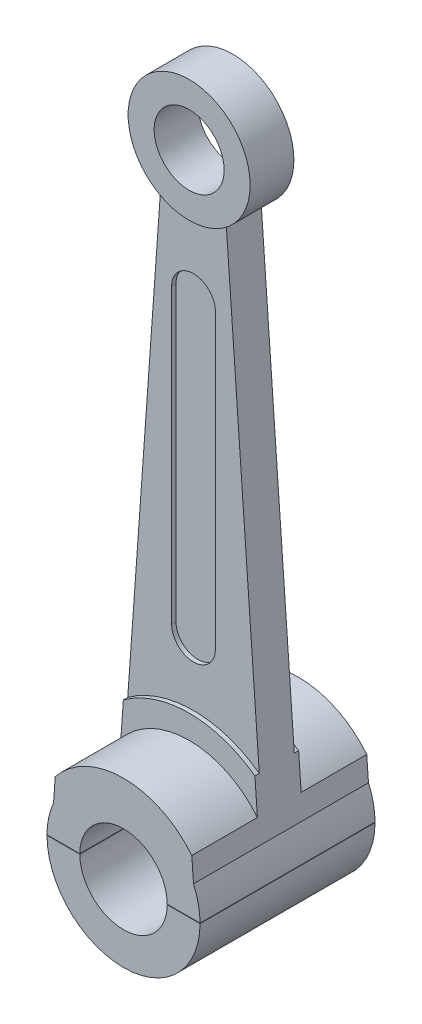
ISO-10303-21;
HEADER;
FILE_DESCRIPTION(('STEP AP214'),'2;1');
FILE_NAME('part.step','',(''),(''),'','','');
FILE_SCHEMA(('AUTOMOTIVE_DESIGN { 1 0 10303 214 1 1 1 1 }'));
ENDSEC;
DATA;
#1=APPLICATION_CONTEXT('core data for automotive mechanical design processes');
#2=APPLICATION_PROTOCOL_DEFINITION('international standard','automotive_design',2000,#1);
#3=PRODUCT_CONTEXT('',#1,'mechanical');
#4=PRODUCT('Part','Part','',(#3));
#5=PRODUCT_RELATED_PRODUCT_CATEGORY('part','',(#4));
#6=PRODUCT_DEFINITION_FORMATION('','',#4);
#7=PRODUCT_DEFINITION_CONTEXT('part definition',#1,'design');
#8=PRODUCT_DEFINITION('design','',#6,#7);
#9=PRODUCT_DEFINITION_SHAPE('','',#8);
#10=(LENGTH_UNIT() NAMED_UNIT(*) SI_UNIT(.MILLI.,.METRE.));
#11=(NAMED_UNIT(*) PLANE_ANGLE_UNIT() SI_UNIT($,.RADIAN.));
#12=(NAMED_UNIT(*) SI_UNIT($,.STERADIAN.) SOLID_ANGLE_UNIT());
#13=UNCERTAINTY_MEASURE_WITH_UNIT(LENGTH_MEASURE(1.E-05),#10,'distance_accuracy_value','');
#14=(GEOMETRIC_REPRESENTATION_CONTEXT(3) GLOBAL_UNCERTAINTY_ASSIGNED_CONTEXT((#13)) GLOBAL_UNIT_ASSIGNED_CONTEXT((#10,
#11,#12)) REPRESENTATION_CONTEXT('',''));
#15=CARTESIAN_POINT('',(0.,0.,0.));
#16=DIRECTION('',(0.,0.,1.));
#17=DIRECTION('',(1.,0.,0.));
#18=AXIS2_PLACEMENT_3D('',#15,#16,#17);
#19=CARTESIAN_POINT('',(0.,0.,-2.));
#20=DIRECTION('',(0.,0.,1.));
#21=DIRECTION('',(1.,0.,0.));
#22=AXIS2_PLACEMENT_3D('',#19,#20,#21);
#23=CYLINDRICAL_SURFACE('',#22,1.75);
#24=CARTESIAN_POINT('',(0.,0.,-2.));
#25=DIRECTION('',(0.,0.,-1.));
#26=DIRECTION('',(-1.,0.,0.));
#27=AXIS2_PLACEMENT_3D('',#24,#25,#26);
#28=CIRCLE('',#27,1.75);
#29=CARTESIAN_POINT('',(-1.74999285712828,0.00499999999999999,-2.));
#30=VERTEX_POINT('',#29);
#31=CARTESIAN_POINT('',(-1.6,0.708872343937891,-2.));
#32=VERTEX_POINT('',#31);
#33=EDGE_CURVE('E389',#30,#32,#28,.T.);
#34=ORIENTED_EDGE('',*,*,#33,.F.);
#35=DIRECTION('',(0.,0.,1.));
#36=VECTOR('',#35,1.);
#37=CARTESIAN_POINT('',(-1.74999285712828,0.00499999999999999,-2.));
#38=LINE('',#37,#36);
#39=CARTESIAN_POINT('',(-1.74999285712828,0.00499999999999999,2.));
#40=VERTEX_POINT('',#39);
#41=EDGE_CURVE('E237',#30,#40,#38,.T.);
#42=ORIENTED_EDGE('',*,*,#41,.T.);
#43=CARTESIAN_POINT('',(0.,0.,2.));
#44=DIRECTION('',(0.,0.,-1.));
#45=DIRECTION('',(-1.,0.,0.));
#46=AXIS2_PLACEMENT_3D('',#43,#44,#45);
#47=CIRCLE('',#46,1.75);
#48=CARTESIAN_POINT('',(-1.6,0.708872343937891,2.));
#49=VERTEX_POINT('',#48);
#50=EDGE_CURVE('E232',#40,#49,#47,.T.);
#51=ORIENTED_EDGE('',*,*,#50,.T.);
#52=DIRECTION('',(0.,0.,1.));
#53=VECTOR('',#52,1.);
#54=CARTESIAN_POINT('',(-1.6,0.708872343937891,-2.));
#55=LINE('',#54,#53);
#56=EDGE_CURVE('E374',#32,#49,#55,.T.);
#57=ORIENTED_EDGE('',*,*,#56,.F.);
#58=EDGE_LOOP('',(#34,#42,#51,#57));
#59=FACE_BOUND('',#58,.T.);
#60=ADVANCED_FACE('F43',(#59),#23,.T.);
#61=CARTESIAN_POINT('',(0.,0.,0.5));
#62=DIRECTION('',(0.,0.,-1.));
#63=DIRECTION('',(-1.,0.,0.));
#64=AXIS2_PLACEMENT_3D('',#61,#62,#63);
#65=CYLINDRICAL_SURFACE('',#64,2.54);
#66=CARTESIAN_POINT('',(0.,0.,0.5));
#67=DIRECTION('',(0.,0.,1.));
#68=DIRECTION('',(1.,0.,0.));
#69=AXIS2_PLACEMENT_3D('',#66,#67,#68);
#70=CIRCLE('',#69,2.54);
#71=CARTESIAN_POINT('',(1.5036414370813,2.04711075144753,0.5));
#72=VERTEX_POINT('',#71);
#73=CARTESIAN_POINT('',(-1.5036414370813,2.04711075144753,0.5));
#74=VERTEX_POINT('',#73);
#75=EDGE_CURVE('E328',#72,#74,#70,.T.);
#76=ORIENTED_EDGE('',*,*,#75,.F.);
#77=DIRECTION('',(0.,0.,-1.));
#78=VECTOR('',#77,1.);
#79=CARTESIAN_POINT('',(1.5036414370813,2.04711075144753,0.5));
#80=LINE('',#79,#78);
#81=CARTESIAN_POINT('',(1.5036414370813,2.04711075144753,0.4));
#82=VERTEX_POINT('',#81);
#83=EDGE_CURVE('E236',#72,#82,#80,.T.);
#84=ORIENTED_EDGE('',*,*,#83,.T.);
#85=CARTESIAN_POINT('',(0.,0.,0.4));
#86=DIRECTION('',(0.,0.,1.));
#87=DIRECTION('',(1.,0.,0.));
#88=AXIS2_PLACEMENT_3D('',#85,#86,#87);
#89=CIRCLE('',#88,2.54);
#90=CARTESIAN_POINT('',(-1.5036414370813,2.04711075144753,0.4));
#91=VERTEX_POINT('',#90);
#92=EDGE_CURVE('E244',#82,#91,#89,.T.);
#93=ORIENTED_EDGE('',*,*,#92,.T.);
#94=DIRECTION('',(0.,0.,-1.));
#95=VECTOR('',#94,1.);
#96=CARTESIAN_POINT('',(-1.5036414370813,2.04711075144753,0.5));
#97=LINE('',#96,#95);
#98=EDGE_CURVE('E314',#91,#74,#97,.F.);
#99=ORIENTED_EDGE('',*,*,#98,.T.);
#100=EDGE_LOOP('',(#76,#84,#93,#99));
#101=FACE_BOUND('',#100,.T.);
#102=ADVANCED_FACE('F434',(#101),#65,.T.);
#103=CARTESIAN_POINT('',(0.,4.,0.4));
#104=DIRECTION('',(0.,0.,-1.));
#105=DIRECTION('',(-1.,0.,0.));
#106=AXIS2_PLACEMENT_3D('',#103,#104,#105);
#107=CYLINDRICAL_SURFACE('',#106,0.5);
#108=DIRECTION('',(0.,0.,-1.));
#109=VECTOR('',#108,1.);
#110=CARTESIAN_POINT('',(-0.499999999999999,4.,0.4));
#111=LINE('',#110,#109);
#112=CARTESIAN_POINT('',(-0.499999999999999,4.,-0.3));
#113=VERTEX_POINT('',#112);
#114=CARTESIAN_POINT('',(-0.499999999999999,4.,-0.4));
#115=VERTEX_POINT('',#114);
#116=EDGE_CURVE('E276',#113,#115,#111,.T.);
#117=ORIENTED_EDGE('',*,*,#116,.F.);
#118=CARTESIAN_POINT('',(0.,4.,-0.3));
#119=DIRECTION('',(0.,0.,1.));
#120=DIRECTION('',(1.,0.,0.));
#121=AXIS2_PLACEMENT_3D('',#118,#119,#120);
#122=CIRCLE('',#121,0.5);
#123=CARTESIAN_POINT('',(0.500000000000001,4.,-0.3));
#124=VERTEX_POINT('',#123);
#125=EDGE_CURVE('E335',#113,#124,#122,.T.);
#126=ORIENTED_EDGE('',*,*,#125,.T.);
#127=DIRECTION('',(0.,0.,-1.));
#128=VECTOR('',#127,1.);
#129=CARTESIAN_POINT('',(0.500000000000001,4.,0.4));
#130=LINE('',#129,#128);
#131=CARTESIAN_POINT('',(0.500000000000001,4.,-0.4));
#132=VERTEX_POINT('',#131);
#133=EDGE_CURVE('E288',#124,#132,#130,.T.);
#134=ORIENTED_EDGE('',*,*,#133,.T.);
#135=CARTESIAN_POINT('',(0.,4.,-0.4));
#136=DIRECTION('',(0.,0.,1.));
#137=DIRECTION('',(1.,0.,0.));
#138=AXIS2_PLACEMENT_3D('',#135,#136,#137);
#139=CIRCLE('',#138,0.5);
#140=EDGE_CURVE('E306',#115,#132,#139,.T.);
#141=ORIENTED_EDGE('',*,*,#140,.F.);
#142=EDGE_LOOP('',(#117,#126,#134,#141));
#143=FACE_BOUND('',#142,.T.);
#144=ADVANCED_FACE('F460',(#143),#107,.F.);
#145=CARTESIAN_POINT('',(-0.499999999999998,0.,0.4));
#146=DIRECTION('',(1.,0.,0.));
#147=DIRECTION('',(0.,1.,0.));
#148=AXIS2_PLACEMENT_3D('',#145,#146,#147);
#149=PLANE('',#148);
#150=DIRECTION('',(0.,0.,-1.));
#151=VECTOR('',#150,1.);
#152=CARTESIAN_POINT('',(-0.5,10.69,0.4));
#153=LINE('',#152,#151);
#154=CARTESIAN_POINT('',(-0.5,10.69,-0.3));
#155=VERTEX_POINT('',#154);
#156=CARTESIAN_POINT('',(-0.5,10.69,-0.4));
#157=VERTEX_POINT('',#156);
#158=EDGE_CURVE('E281',#155,#157,#153,.T.);
#159=ORIENTED_EDGE('',*,*,#158,.F.);
#160=DIRECTION('',(0.,-1.,0.));
#161=VECTOR('',#160,1.);
#162=CARTESIAN_POINT('',(-0.5,10.69,-0.3));
#163=LINE('',#162,#161);
#164=EDGE_CURVE('E338',#155,#113,#163,.T.);
#165=ORIENTED_EDGE('',*,*,#164,.T.);
#166=ORIENTED_EDGE('',*,*,#116,.T.);
#167=DIRECTION('',(0.,-1.,0.));
#168=VECTOR('',#167,1.);
#169=CARTESIAN_POINT('',(-0.499999999999998,0.,-0.4));
#170=LINE('',#169,#168);
#171=EDGE_CURVE('E300',#157,#115,#170,.T.);
#172=ORIENTED_EDGE('',*,*,#171,.F.);
#173=EDGE_LOOP('',(#159,#165,#166,#172));
#174=FACE_BOUND('',#173,.T.);
#175=ADVANCED_FACE('F615',(#174),#149,.T.);
#176=CARTESIAN_POINT('',(0.,10.69,0.4));
#177=DIRECTION('',(0.,0.,-1.));
#178=DIRECTION('',(-1.,0.,0.));
#179=AXIS2_PLACEMENT_3D('',#176,#177,#178);
#180=CYLINDRICAL_SURFACE('',#179,0.5);
#181=DIRECTION('',(0.,0.,-1.));
#182=VECTOR('',#181,1.);
#183=CARTESIAN_POINT('',(0.5,10.69,0.4));
#184=LINE('',#183,#182);
#185=CARTESIAN_POINT('',(0.5,10.69,-0.3));
#186=VERTEX_POINT('',#185);
#187=CARTESIAN_POINT('',(0.5,10.69,-0.4));
#188=VERTEX_POINT('',#187);
#189=EDGE_CURVE('E285',#186,#188,#184,.T.);
#190=ORIENTED_EDGE('',*,*,#189,.F.);
#191=CARTESIAN_POINT('',(0.,10.69,-0.3));
#192=DIRECTION('',(0.,0.,1.));
#193=DIRECTION('',(1.,0.,0.));
#194=AXIS2_PLACEMENT_3D('',#191,#192,#193);
#195=CIRCLE('',#194,0.5);
#196=EDGE_CURVE('E340',#186,#155,#195,.T.);
#197=ORIENTED_EDGE('',*,*,#196,.T.);
#198=ORIENTED_EDGE('',*,*,#158,.T.);
#199=CARTESIAN_POINT('',(0.,10.69,-0.4));
#200=DIRECTION('',(0.,0.,1.));
#201=DIRECTION('',(1.,0.,0.));
#202=AXIS2_PLACEMENT_3D('',#199,#200,#201);
#203=CIRCLE('',#202,0.5);
#204=EDGE_CURVE('E303',#188,#157,#203,.T.);
#205=ORIENTED_EDGE('',*,*,#204,.F.);
#206=EDGE_LOOP('',(#190,#197,#198,#205));
#207=FACE_BOUND('',#206,.T.);
#208=ADVANCED_FACE('F605',(#207),#180,.F.);
#209=CARTESIAN_POINT('',(0.500000000000002,0.,0.4));
#210=DIRECTION('',(1.,0.,0.));
#211=DIRECTION('',(0.,1.,0.));
#212=AXIS2_PLACEMENT_3D('',#209,#210,#211);
#213=PLANE('',#212);
#214=DIRECTION('',(0.,-1.,0.));
#215=VECTOR('',#214,1.);
#216=CARTESIAN_POINT('',(0.5,10.69,-0.3));
#217=LINE('',#216,#215);
#218=EDGE_CURVE('E331',#186,#124,#217,.T.);
#219=ORIENTED_EDGE('',*,*,#218,.F.);
#220=ORIENTED_EDGE('',*,*,#189,.T.);
#221=DIRECTION('',(0.,-1.,0.));
#222=VECTOR('',#221,1.);
#223=CARTESIAN_POINT('',(0.500000000000002,0.,-0.4));
#224=LINE('',#223,#222);
#225=EDGE_CURVE('E270',#188,#132,#224,.T.);
#226=ORIENTED_EDGE('',*,*,#225,.T.);
#227=ORIENTED_EDGE('',*,*,#133,.F.);
#228=EDGE_LOOP('',(#219,#220,#226,#227));
#229=FACE_BOUND('',#228,.T.);
#230=ADVANCED_FACE('F595',(#229),#213,.F.);
#231=CARTESIAN_POINT('',(0.,13.69,0.5));
#232=DIRECTION('',(0.,0.,-1.));
#233=DIRECTION('',(-1.,0.,0.));
#234=AXIS2_PLACEMENT_3D('',#231,#232,#233);
#235=CYLINDRICAL_SURFACE('',#234,0.8);
#236=CARTESIAN_POINT('',(0.,13.69,0.5));
#237=DIRECTION('',(0.,0.,1.));
#238=DIRECTION('',(1.,0.,0.));
#239=AXIS2_PLACEMENT_3D('',#236,#237,#238);
#240=CIRCLE('',#239,0.8);
#241=CARTESIAN_POINT('',(0.799999999999999,13.69,0.5));
#242=VERTEX_POINT('',#241);
#243=EDGE_CURVE('E266',#242,#242,#240,.T.);
#244=ORIENTED_EDGE('',*,*,#243,.T.);
#245=EDGE_LOOP('',(#244));
#246=FACE_BOUND('',#245,.T.);
#247=CARTESIAN_POINT('',(0.,13.69,-0.5));
#248=DIRECTION('',(0.,0.,1.));
#249=DIRECTION('',(1.,0.,0.));
#250=AXIS2_PLACEMENT_3D('',#247,#248,#249);
#251=CIRCLE('',#250,0.8);
#252=CARTESIAN_POINT('',(0.799999999999999,13.69,-0.5));
#253=VERTEX_POINT('',#252);
#254=EDGE_CURVE('E260',#253,#253,#251,.T.);
#255=ORIENTED_EDGE('',*,*,#254,.F.);
#256=EDGE_LOOP('',(#255));
#257=FACE_BOUND('',#256,.T.);
#258=ADVANCED_FACE('F648',(#246,#257),#235,.F.);
#259=CARTESIAN_POINT('',(0.,13.69,0.5));
#260=DIRECTION('',(0.,0.,-1.));
#261=DIRECTION('',(-1.,0.,0.));
#262=AXIS2_PLACEMENT_3D('',#259,#260,#261);
#263=CYLINDRICAL_SURFACE('',#262,1.395);
#264=CARTESIAN_POINT('',(0.,13.69,0.4));
#265=DIRECTION('',(0.,0.,1.));
#266=DIRECTION('',(1.,0.,0.));
#267=AXIS2_PLACEMENT_3D('',#264,#265,#266);
#268=CIRCLE('',#267,1.395);
#269=CARTESIAN_POINT('',(-0.75,12.5137666047931,0.4));
#270=VERTEX_POINT('',#269);
#271=CARTESIAN_POINT('',(0.749999999999999,12.5137666047931,0.4));
#272=VERTEX_POINT('',#271);
#273=EDGE_CURVE('E269',#270,#272,#268,.T.);
#274=ORIENTED_EDGE('',*,*,#273,.T.);
#275=DIRECTION('',(0.,0.,-1.));
#276=VECTOR('',#275,1.);
#277=CARTESIAN_POINT('',(0.75,12.5137666047931,0.4));
#278=LINE('',#277,#276);
#279=CARTESIAN_POINT('',(0.749999999999999,12.5137666047931,-0.4));
#280=VERTEX_POINT('',#279);
#281=EDGE_CURVE('E259',#272,#280,#278,.T.);
#282=ORIENTED_EDGE('',*,*,#281,.T.);
#283=CARTESIAN_POINT('',(0.,13.69,-0.4));
#284=DIRECTION('',(0.,0.,1.));
#285=DIRECTION('',(1.,0.,0.));
#286=AXIS2_PLACEMENT_3D('',#283,#284,#285);
#287=CIRCLE('',#286,1.395);
#288=CARTESIAN_POINT('',(-0.75,12.5137666047931,-0.4));
#289=VERTEX_POINT('',#288);
#290=EDGE_CURVE('E297',#289,#280,#287,.T.);
#291=ORIENTED_EDGE('',*,*,#290,.F.);
#292=DIRECTION('',(0.,0.,-1.));
#293=VECTOR('',#292,1.);
#294=CARTESIAN_POINT('',(-0.75,12.5137666047931,0.4));
#295=LINE('',#294,#293);
#296=EDGE_CURVE('E231',#270,#289,#295,.T.);
#297=ORIENTED_EDGE('',*,*,#296,.F.);
#298=EDGE_LOOP('',(#274,#282,#291,#297));
#299=FACE_BOUND('',#298,.T.);
#300=CARTESIAN_POINT('',(0.,13.69,-0.5));
#301=DIRECTION('',(0.,0.,1.));
#302=DIRECTION('',(1.,0.,0.));
#303=AXIS2_PLACEMENT_3D('',#300,#301,#302);
#304=CIRCLE('',#303,1.395);
#305=CARTESIAN_POINT('',(1.395,13.69,-0.5));
#306=VERTEX_POINT('',#305);
#307=EDGE_CURVE('E255',#306,#306,#304,.T.);
#308=ORIENTED_EDGE('',*,*,#307,.T.);
#309=EDGE_LOOP('',(#308));
#310=FACE_BOUND('',#309,.T.);
#311=CARTESIAN_POINT('',(0.,13.69,0.5));
#312=DIRECTION('',(0.,0.,1.));
#313=DIRECTION('',(1.,0.,0.));
#314=AXIS2_PLACEMENT_3D('',#311,#312,#313);
#315=CIRCLE('',#314,1.395);
#316=CARTESIAN_POINT('',(1.395,13.69,0.5));
#317=VERTEX_POINT('',#316);
#318=EDGE_CURVE('E258',#317,#317,#315,.T.);
#319=ORIENTED_EDGE('',*,*,#318,.F.);
#320=EDGE_LOOP('',(#319));
#321=FACE_BOUND('',#320,.T.);
#322=ADVANCED_FACE('F422',(#299,#310,#321),#263,.T.);
#323=CARTESIAN_POINT('',(0.,0.,0.5));
#324=DIRECTION('',(0.,0.,1.));
#325=DIRECTION('',(1.,0.,0.));
#326=AXIS2_PLACEMENT_3D('',#323,#324,#325);
#327=PLANE('',#326);
#328=ORIENTED_EDGE('',*,*,#243,.F.);
#329=EDGE_LOOP('',(#328));
#330=FACE_BOUND('',#329,.T.);
#331=ORIENTED_EDGE('',*,*,#318,.T.);
#332=EDGE_LOOP('',(#331));
#333=FACE_BOUND('',#332,.T.);
#334=ADVANCED_FACE('F631',(#330,#333),#327,.T.);
#335=CARTESIAN_POINT('',(0.,0.,-0.5));
#336=DIRECTION('',(0.,0.,1.));
#337=DIRECTION('',(1.,0.,0.));
#338=AXIS2_PLACEMENT_3D('',#335,#336,#337);
#339=PLANE('',#338);
#340=ORIENTED_EDGE('',*,*,#254,.T.);
#341=EDGE_LOOP('',(#340));
#342=FACE_BOUND('',#341,.T.);
#343=ORIENTED_EDGE('',*,*,#307,.F.);
#344=EDGE_LOOP('',(#343));
#345=FACE_BOUND('',#344,.T.);
#346=ADVANCED_FACE('F622',(#342,#345),#339,.F.);
#347=CARTESIAN_POINT('',(0.,4.,0.3));
#348=DIRECTION('',(0.,0.,1.));
#349=DIRECTION('',(1.,0.,0.));
#350=AXIS2_PLACEMENT_3D('',#347,#348,#349);
#351=CIRCLE('',#350,0.5);
#352=CARTESIAN_POINT('',(-0.499999999999999,4.,0.3));
#353=VERTEX_POINT('',#352);
#354=CARTESIAN_POINT('',(0.500000000000001,4.,0.3));
#355=VERTEX_POINT('',#354);
#356=EDGE_CURVE('E344',#353,#355,#351,.T.);
#357=ORIENTED_EDGE('',*,*,#356,.F.);
#358=CARTESIAN_POINT('',(-0.499999999999999,4.,0.4));
#359=VERTEX_POINT('',#358);
#360=EDGE_CURVE('E271',#359,#353,#111,.T.);
#361=ORIENTED_EDGE('',*,*,#360,.F.);
#362=CARTESIAN_POINT('',(0.,4.,0.4));
#363=DIRECTION('',(0.,0.,1.));
#364=DIRECTION('',(1.,0.,0.));
#365=AXIS2_PLACEMENT_3D('',#362,#363,#364);
#366=CIRCLE('',#365,0.5);
#367=CARTESIAN_POINT('',(0.500000000000001,4.,0.4));
#368=VERTEX_POINT('',#367);
#369=EDGE_CURVE('E263',#359,#368,#366,.T.);
#370=ORIENTED_EDGE('',*,*,#369,.T.);
#371=EDGE_CURVE('E286',#368,#355,#130,.T.);
#372=ORIENTED_EDGE('',*,*,#371,.T.);
#373=EDGE_LOOP('',(#357,#361,#370,#372));
#374=FACE_BOUND('',#373,.T.);
#375=ADVANCED_FACE('F612',(#374),#107,.F.);
#376=DIRECTION('',(0.,-1.,0.));
#377=VECTOR('',#376,1.);
#378=CARTESIAN_POINT('',(-0.5,10.69,0.3));
#379=LINE('',#378,#377);
#380=CARTESIAN_POINT('',(-0.5,10.69,0.3));
#381=VERTEX_POINT('',#380);
#382=EDGE_CURVE('E347',#381,#353,#379,.T.);
#383=ORIENTED_EDGE('',*,*,#382,.F.);
#384=CARTESIAN_POINT('',(-0.5,10.69,0.4));
#385=VERTEX_POINT('',#384);
#386=EDGE_CURVE('E277',#385,#381,#153,.T.);
#387=ORIENTED_EDGE('',*,*,#386,.F.);
#388=DIRECTION('',(0.,-1.,0.));
#389=VECTOR('',#388,1.);
#390=CARTESIAN_POINT('',(-0.499999999999998,0.,0.4));
#391=LINE('',#390,#389);
#392=EDGE_CURVE('E275',#385,#359,#391,.T.);
#393=ORIENTED_EDGE('',*,*,#392,.T.);
#394=ORIENTED_EDGE('',*,*,#360,.T.);
#395=EDGE_LOOP('',(#383,#387,#393,#394));
#396=FACE_BOUND('',#395,.T.);
#397=ADVANCED_FACE('F602',(#396),#149,.T.);
#398=CARTESIAN_POINT('',(0.,10.69,0.3));
#399=DIRECTION('',(0.,0.,1.));
#400=DIRECTION('',(1.,0.,0.));
#401=AXIS2_PLACEMENT_3D('',#398,#399,#400);
#402=CIRCLE('',#401,0.5);
#403=CARTESIAN_POINT('',(0.5,10.69,0.3));
#404=VERTEX_POINT('',#403);
#405=EDGE_CURVE('E334',#404,#381,#402,.T.);
#406=ORIENTED_EDGE('',*,*,#405,.F.);
#407=CARTESIAN_POINT('',(0.5,10.69,0.4));
#408=VERTEX_POINT('',#407);
#409=EDGE_CURVE('E280',#408,#404,#184,.T.);
#410=ORIENTED_EDGE('',*,*,#409,.F.);
#411=CARTESIAN_POINT('',(0.,10.69,0.4));
#412=DIRECTION('',(0.,0.,1.));
#413=DIRECTION('',(1.,0.,0.));
#414=AXIS2_PLACEMENT_3D('',#411,#412,#413);
#415=CIRCLE('',#414,0.5);
#416=EDGE_CURVE('E274',#408,#385,#415,.T.);
#417=ORIENTED_EDGE('',*,*,#416,.T.);
#418=ORIENTED_EDGE('',*,*,#386,.T.);
#419=EDGE_LOOP('',(#406,#410,#417,#418));
#420=FACE_BOUND('',#419,.T.);
#421=ADVANCED_FACE('F592',(#420),#180,.F.);
#422=ORIENTED_EDGE('',*,*,#409,.T.);
#423=DIRECTION('',(0.,-1.,0.));
#424=VECTOR('',#423,1.);
#425=CARTESIAN_POINT('',(0.5,10.69,0.3));
#426=LINE('',#425,#424);
#427=EDGE_CURVE('E284',#404,#355,#426,.T.);
#428=ORIENTED_EDGE('',*,*,#427,.T.);
#429=ORIENTED_EDGE('',*,*,#371,.F.);
#430=DIRECTION('',(0.,-1.,0.));
#431=VECTOR('',#430,1.);
#432=CARTESIAN_POINT('',(0.500000000000002,0.,0.4));
#433=LINE('',#432,#431);
#434=EDGE_CURVE('E311',#408,#368,#433,.T.);
#435=ORIENTED_EDGE('',*,*,#434,.F.);
#436=EDGE_LOOP('',(#422,#428,#429,#435));
#437=FACE_BOUND('',#436,.T.);
#438=ADVANCED_FACE('F584',(#437),#213,.F.);
#439=CARTESIAN_POINT('',(0.,0.,0.4));
#440=DIRECTION('',(0.,0.,1.));
#441=DIRECTION('',(1.,0.,0.));
#442=AXIS2_PLACEMENT_3D('',#439,#440,#441);
#443=PLANE('',#442);
#444=DIRECTION('',(0.0718181006562887,-0.997417746191697,0.));
#445=VECTOR('',#444,1.);
#446=CARTESIAN_POINT('',(1.64252585982471,0.118268486781843,0.4));
#447=LINE('',#446,#445);
#448=EDGE_CURVE('E358',#272,#82,#447,.T.);
#449=ORIENTED_EDGE('',*,*,#448,.F.);
#450=ORIENTED_EDGE('',*,*,#273,.F.);
#451=DIRECTION('',(0.0718181006562887,0.997417746191697,0.));
#452=VECTOR('',#451,1.);
#453=CARTESIAN_POINT('',(-1.64252585982471,0.118268486781843,0.4));
#454=LINE('',#453,#452);
#455=EDGE_CURVE('E234',#91,#270,#454,.T.);
#456=ORIENTED_EDGE('',*,*,#455,.F.);
#457=ORIENTED_EDGE('',*,*,#92,.F.);
#458=EDGE_LOOP('',(#449,#450,#456,#457));
#459=FACE_BOUND('',#458,.T.);
#460=ORIENTED_EDGE('',*,*,#369,.F.);
#461=ORIENTED_EDGE('',*,*,#392,.F.);
#462=ORIENTED_EDGE('',*,*,#416,.F.);
#463=ORIENTED_EDGE('',*,*,#434,.T.);
#464=EDGE_LOOP('',(#460,#461,#462,#463));
#465=FACE_BOUND('',#464,.T.);
#466=ADVANCED_FACE('F428',(#459,#465),#443,.T.);
#467=CARTESIAN_POINT('',(0.,0.,-0.4));
#468=DIRECTION('',(0.,0.,1.));
#469=DIRECTION('',(1.,0.,0.));
#470=AXIS2_PLACEMENT_3D('',#467,#468,#469);
#471=PLANE('',#470);
#472=ORIENTED_EDGE('',*,*,#140,.T.);
#473=ORIENTED_EDGE('',*,*,#225,.F.);
#474=ORIENTED_EDGE('',*,*,#204,.T.);
#475=ORIENTED_EDGE('',*,*,#171,.T.);
#476=EDGE_LOOP('',(#472,#473,#474,#475));
#477=FACE_BOUND('',#476,.T.);
#478=ORIENTED_EDGE('',*,*,#290,.T.);
#479=DIRECTION('',(0.0718181006562887,-0.997417746191697,0.));
#480=VECTOR('',#479,1.);
#481=CARTESIAN_POINT('',(1.64252585982471,0.118268486781843,-0.4));
#482=LINE('',#481,#480);
#483=CARTESIAN_POINT('',(1.5036414370813,2.04711075144753,-0.4));
#484=VERTEX_POINT('',#483);
#485=EDGE_CURVE('E296',#280,#484,#482,.T.);
#486=ORIENTED_EDGE('',*,*,#485,.T.);
#487=CARTESIAN_POINT('',(0.,0.,-0.4));
#488=DIRECTION('',(0.,0.,1.));
#489=DIRECTION('',(1.,0.,0.));
#490=AXIS2_PLACEMENT_3D('',#487,#488,#489);
#491=CIRCLE('',#490,2.54);
#492=CARTESIAN_POINT('',(-1.5036414370813,2.04711075144753,-0.4));
#493=VERTEX_POINT('',#492);
#494=EDGE_CURVE('E292',#484,#493,#491,.T.);
#495=ORIENTED_EDGE('',*,*,#494,.T.);
#496=DIRECTION('',(0.0718181006562887,0.997417746191697,0.));
#497=VECTOR('',#496,1.);
#498=CARTESIAN_POINT('',(-1.64252585982471,0.118268486781843,-0.4));
#499=LINE('',#498,#497);
#500=EDGE_CURVE('E295',#493,#289,#499,.T.);
#501=ORIENTED_EDGE('',*,*,#500,.T.);
#502=EDGE_LOOP('',(#478,#486,#495,#501));
#503=FACE_BOUND('',#502,.T.);
#504=ADVANCED_FACE('F418',(#477,#503),#471,.F.);
#505=ORIENTED_EDGE('',*,*,#494,.F.);
#506=CARTESIAN_POINT('',(1.5036414370813,2.04711075144753,-0.5));
#507=VERTEX_POINT('',#506);
#508=EDGE_CURVE('E246',#484,#507,#80,.T.);
#509=ORIENTED_EDGE('',*,*,#508,.T.);
#510=CARTESIAN_POINT('',(0.,0.,-0.5));
#511=DIRECTION('',(0.,0.,1.));
#512=DIRECTION('',(1.,0.,0.));
#513=AXIS2_PLACEMENT_3D('',#510,#511,#512);
#514=CIRCLE('',#513,2.54);
#515=CARTESIAN_POINT('',(-1.5036414370813,2.04711075144753,-0.5));
#516=VERTEX_POINT('',#515);
#517=EDGE_CURVE('E324',#507,#516,#514,.T.);
#518=ORIENTED_EDGE('',*,*,#517,.T.);
#519=EDGE_CURVE('E327',#516,#493,#97,.F.);
#520=ORIENTED_EDGE('',*,*,#519,.T.);
#521=EDGE_LOOP('',(#505,#509,#518,#520));
#522=FACE_BOUND('',#521,.T.);
#523=ADVANCED_FACE('F415',(#522),#65,.T.);
#524=CARTESIAN_POINT('',(0.,0.,0.5));
#525=DIRECTION('',(0.,0.,1.));
#526=DIRECTION('',(1.,0.,0.));
#527=AXIS2_PLACEMENT_3D('',#524,#525,#526);
#528=PLANE('',#527);
#529=DIRECTION('',(0.0718181006562887,-0.997417746191697,0.));
#530=VECTOR('',#529,1.);
#531=CARTESIAN_POINT('',(1.64252585982471,0.118268486781843,0.5));
#532=LINE('',#531,#530);
#533=CARTESIAN_POINT('',(1.56101559444764,1.25029209142955,0.5));
#534=VERTEX_POINT('',#533);
#535=EDGE_CURVE('E365',#72,#534,#532,.T.);
#536=ORIENTED_EDGE('',*,*,#535,.F.);
#537=ORIENTED_EDGE('',*,*,#75,.T.);
#538=DIRECTION('',(0.0718181006562887,0.997417746191697,0.));
#539=VECTOR('',#538,1.);
#540=CARTESIAN_POINT('',(-1.64252585982471,0.118268486781843,0.5));
#541=LINE('',#540,#539);
#542=CARTESIAN_POINT('',(-1.56101559444764,1.25029209142955,0.5));
#543=VERTEX_POINT('',#542);
#544=EDGE_CURVE('E376',#543,#74,#541,.T.);
#545=ORIENTED_EDGE('',*,*,#544,.F.);
#546=CARTESIAN_POINT('',(0.,0.,0.5));
#547=DIRECTION('',(0.,0.,1.));
#548=DIRECTION('',(1.,0.,0.));
#549=AXIS2_PLACEMENT_3D('',#546,#547,#548);
#550=CIRCLE('',#549,2.);
#551=EDGE_CURVE('E350',#534,#543,#550,.T.);
#552=ORIENTED_EDGE('',*,*,#551,.F.);
#553=EDGE_LOOP('',(#536,#537,#545,#552));
#554=FACE_BOUND('',#553,.T.);
#555=ADVANCED_FACE('F437',(#554),#528,.T.);
#556=CARTESIAN_POINT('',(0.,0.,-0.5));
#557=DIRECTION('',(0.,0.,1.));
#558=DIRECTION('',(1.,0.,0.));
#559=AXIS2_PLACEMENT_3D('',#556,#557,#558);
#560=PLANE('',#559);
#561=ORIENTED_EDGE('',*,*,#517,.F.);
#562=DIRECTION('',(0.0718181006562887,-0.997417746191697,0.));
#563=VECTOR('',#562,1.);
#564=CARTESIAN_POINT('',(1.64252585982471,0.118268486781843,-0.5));
#565=LINE('',#564,#563);
#566=CARTESIAN_POINT('',(1.56101559444764,1.25029209142955,-0.5));
#567=VERTEX_POINT('',#566);
#568=EDGE_CURVE('E254',#507,#567,#565,.T.);
#569=ORIENTED_EDGE('',*,*,#568,.T.);
#570=CARTESIAN_POINT('',(0.,0.,-0.5));
#571=DIRECTION('',(0.,0.,1.));
#572=DIRECTION('',(1.,0.,0.));
#573=AXIS2_PLACEMENT_3D('',#570,#571,#572);
#574=CIRCLE('',#573,2.);
#575=CARTESIAN_POINT('',(-1.56101559444764,1.25029209142955,-0.5));
#576=VERTEX_POINT('',#575);
#577=EDGE_CURVE('E250',#567,#576,#574,.T.);
#578=ORIENTED_EDGE('',*,*,#577,.T.);
#579=DIRECTION('',(0.0718181006562887,0.997417746191697,0.));
#580=VECTOR('',#579,1.);
#581=CARTESIAN_POINT('',(-1.64252585982471,0.118268486781843,-0.5));
#582=LINE('',#581,#580);
#583=EDGE_CURVE('E253',#576,#516,#582,.T.);
#584=ORIENTED_EDGE('',*,*,#583,.T.);
#585=EDGE_LOOP('',(#561,#569,#578,#584));
#586=FACE_BOUND('',#585,.T.);
#587=ADVANCED_FACE('F411',(#586),#560,.F.);
#588=CARTESIAN_POINT('',(0.,10.69,-0.3));
#589=DIRECTION('',(0.,0.,1.));
#590=DIRECTION('',(1.,0.,0.));
#591=AXIS2_PLACEMENT_3D('',#588,#589,#590);
#592=PLANE('',#591);
#593=ORIENTED_EDGE('',*,*,#196,.F.);
#594=ORIENTED_EDGE('',*,*,#218,.T.);
#595=ORIENTED_EDGE('',*,*,#125,.F.);
#596=ORIENTED_EDGE('',*,*,#164,.F.);
#597=EDGE_LOOP('',(#593,#594,#595,#596));
#598=FACE_BOUND('',#597,.T.);
#599=ADVANCED_FACE('F477',(#598),#592,.F.);
#600=CARTESIAN_POINT('',(0.,10.69,0.3));
#601=DIRECTION('',(0.,0.,1.));
#602=DIRECTION('',(1.,0.,0.));
#603=AXIS2_PLACEMENT_3D('',#600,#601,#602);
#604=PLANE('',#603);
#605=ORIENTED_EDGE('',*,*,#405,.T.);
#606=ORIENTED_EDGE('',*,*,#382,.T.);
#607=ORIENTED_EDGE('',*,*,#356,.T.);
#608=ORIENTED_EDGE('',*,*,#427,.F.);
#609=EDGE_LOOP('',(#605,#606,#607,#608));
#610=FACE_BOUND('',#609,.T.);
#611=ADVANCED_FACE('F473',(#610),#604,.T.);
#612=CARTESIAN_POINT('',(0.,0.,-2.));
#613=DIRECTION('',(0.,0.,1.));
#614=DIRECTION('',(1.,0.,0.));
#615=AXIS2_PLACEMENT_3D('',#612,#613,#614);
#616=CYLINDRICAL_SURFACE('',#615,2.);
#617=DIRECTION('',(0.,0.,1.));
#618=VECTOR('',#617,1.);
#619=CARTESIAN_POINT('',(1.56101559444764,1.25029209142955,-2.));
#620=LINE('',#619,#618);
#621=CARTESIAN_POINT('',(1.56101559444764,1.25029209142955,-2.));
#622=VERTEX_POINT('',#621);
#623=EDGE_CURVE('E219',#622,#567,#620,.T.);
#624=ORIENTED_EDGE('',*,*,#623,.F.);
#625=CARTESIAN_POINT('',(0.,0.,-2.));
#626=DIRECTION('',(0.,0.,1.));
#627=DIRECTION('',(1.,0.,0.));
#628=AXIS2_PLACEMENT_3D('',#625,#626,#627);
#629=CIRCLE('',#628,2.);
#630=CARTESIAN_POINT('',(-1.56101559444764,1.25029209142955,-2.));
#631=VERTEX_POINT('',#630);
#632=EDGE_CURVE('E346',#622,#631,#629,.T.);
#633=ORIENTED_EDGE('',*,*,#632,.T.);
#634=DIRECTION('',(0.,0.,1.));
#635=VECTOR('',#634,1.);
#636=CARTESIAN_POINT('',(-1.56101559444764,1.25029209142955,-2.));
#637=LINE('',#636,#635);
#638=EDGE_CURVE('E364',#576,#631,#637,.F.);
#639=ORIENTED_EDGE('',*,*,#638,.F.);
#640=ORIENTED_EDGE('',*,*,#577,.F.);
#641=EDGE_LOOP('',(#624,#633,#639,#640));
#642=FACE_BOUND('',#641,.T.);
#643=ADVANCED_FACE('F408',(#642),#616,.T.);
#644=CARTESIAN_POINT('',(0.,0.,-2.));
#645=DIRECTION('',(0.,0.,1.));
#646=DIRECTION('',(1.,0.,0.));
#647=AXIS2_PLACEMENT_3D('',#644,#645,#646);
#648=PLANE('',#647);
#649=CARTESIAN_POINT('',(1.6,0.708872343937891,-2.));
#650=VERTEX_POINT('',#649);
#651=CARTESIAN_POINT('',(1.74999285712828,0.00499999999999999,-2.));
#652=VERTEX_POINT('',#651);
#653=EDGE_CURVE('E225',#650,#652,#28,.T.);
#654=ORIENTED_EDGE('',*,*,#653,.T.);
#655=DIRECTION('',(-1.,0.,0.));
#656=VECTOR('',#655,1.);
#657=CARTESIAN_POINT('',(-2.94008197126764,0.00499999999999999,-2.));
#658=LINE('',#657,#656);
#659=CARTESIAN_POINT('',(0.999987499921874,0.00499999999999999,-2.));
#660=VERTEX_POINT('',#659);
#661=EDGE_CURVE('E86',#652,#660,#658,.T.);
#662=ORIENTED_EDGE('',*,*,#661,.T.);
#663=CARTESIAN_POINT('',(0.,0.,-2.));
#664=DIRECTION('',(0.,0.,1.));
#665=DIRECTION('',(1.,0.,0.));
#666=AXIS2_PLACEMENT_3D('',#663,#664,#665);
#667=CIRCLE('',#666,1.);
#668=CARTESIAN_POINT('',(-0.999987499921874,0.00499999999999999,-2.));
#669=VERTEX_POINT('',#668);
#670=EDGE_CURVE('E393',#660,#669,#667,.T.);
#671=ORIENTED_EDGE('',*,*,#670,.T.);
#672=EDGE_CURVE('E63',#669,#30,#658,.T.);
#673=ORIENTED_EDGE('',*,*,#672,.T.);
#674=ORIENTED_EDGE('',*,*,#33,.T.);
#675=DIRECTION('',(0.0718181006562887,0.997417746191696,0.));
#676=VECTOR('',#675,1.);
#677=CARTESIAN_POINT('',(-1.6,0.708872343937891,-2.));
#678=LINE('',#677,#676);
#679=EDGE_CURVE('E386',#32,#631,#678,.T.);
#680=ORIENTED_EDGE('',*,*,#679,.T.);
#681=ORIENTED_EDGE('',*,*,#632,.F.);
#682=DIRECTION('',(0.0718181006562887,-0.997417746191696,0.));
#683=VECTOR('',#682,1.);
#684=CARTESIAN_POINT('',(1.6,0.708872343937891,-2.));
#685=LINE('',#684,#683);
#686=EDGE_CURVE('E384',#622,#650,#685,.T.);
#687=ORIENTED_EDGE('',*,*,#686,.T.);
#688=EDGE_LOOP('',(#654,#662,#671,#673,#674,#680,#681,#687));
#689=FACE_BOUND('',#688,.T.);
#690=ADVANCED_FACE('F45',(#689),#648,.F.);
#691=CARTESIAN_POINT('',(0.,0.,0.5));
#692=DIRECTION('',(0.,0.,-1.));
#693=DIRECTION('',(-1.,0.,0.));
#694=AXIS2_PLACEMENT_3D('',#691,#692,#693);
#695=CYLINDRICAL_SURFACE('',#694,1.);
#696=DIRECTION('',(0.,0.,-1.));
#697=VECTOR('',#696,1.);
#698=CARTESIAN_POINT('',(0.999987499921874,0.00499999999999999,0.5));
#699=LINE('',#698,#697);
#700=CARTESIAN_POINT('',(0.999987499921873,0.00499999999999999,2.));
#701=VERTEX_POINT('',#700);
#702=EDGE_CURVE('E227',#701,#660,#699,.T.);
#703=ORIENTED_EDGE('',*,*,#702,.F.);
#704=CARTESIAN_POINT('',(0.,0.,2.));
#705=DIRECTION('',(0.,0.,1.));
#706=DIRECTION('',(1.,0.,0.));
#707=AXIS2_PLACEMENT_3D('',#704,#705,#706);
#708=CIRCLE('',#707,1.);
#709=CARTESIAN_POINT('',(-0.999987499921874,0.00499999999999999,2.));
#710=VERTEX_POINT('',#709);
#711=EDGE_CURVE('E354',#701,#710,#708,.T.);
#712=ORIENTED_EDGE('',*,*,#711,.T.);
#713=DIRECTION('',(0.,0.,-1.));
#714=VECTOR('',#713,1.);
#715=CARTESIAN_POINT('',(-0.999987499921874,0.00499999999999999,0.5));
#716=LINE('',#715,#714);
#717=EDGE_CURVE('E53',#669,#710,#716,.F.);
#718=ORIENTED_EDGE('',*,*,#717,.F.);
#719=ORIENTED_EDGE('',*,*,#670,.F.);
#720=EDGE_LOOP('',(#703,#712,#718,#719));
#721=FACE_BOUND('',#720,.T.);
#722=ADVANCED_FACE('F446',(#721),#695,.F.);
#723=DIRECTION('',(0.,0.,1.));
#724=VECTOR('',#723,1.);
#725=CARTESIAN_POINT('',(1.56101559444764,1.25029209142955,-2.));
#726=LINE('',#725,#724);
#727=CARTESIAN_POINT('',(1.56101559444764,1.25029209142955,2.));
#728=VERTEX_POINT('',#727);
#729=EDGE_CURVE('E214',#534,#728,#726,.T.);
#730=ORIENTED_EDGE('',*,*,#729,.F.);
#731=ORIENTED_EDGE('',*,*,#551,.T.);
#732=DIRECTION('',(0.,0.,1.));
#733=VECTOR('',#732,1.);
#734=CARTESIAN_POINT('',(-1.56101559444764,1.25029209142955,-2.));
#735=LINE('',#734,#733);
#736=CARTESIAN_POINT('',(-1.56101559444764,1.25029209142955,2.));
#737=VERTEX_POINT('',#736);
#738=EDGE_CURVE('E380',#737,#543,#735,.F.);
#739=ORIENTED_EDGE('',*,*,#738,.F.);
#740=CARTESIAN_POINT('',(0.,0.,2.));
#741=DIRECTION('',(0.,0.,1.));
#742=DIRECTION('',(1.,0.,0.));
#743=AXIS2_PLACEMENT_3D('',#740,#741,#742);
#744=CIRCLE('',#743,2.);
#745=EDGE_CURVE('E353',#728,#737,#744,.T.);
#746=ORIENTED_EDGE('',*,*,#745,.F.);
#747=EDGE_LOOP('',(#730,#731,#739,#746));
#748=FACE_BOUND('',#747,.T.);
#749=ADVANCED_FACE('F440',(#748),#616,.T.);
#750=CARTESIAN_POINT('',(0.,0.,2.));
#751=DIRECTION('',(0.,0.,1.));
#752=DIRECTION('',(1.,0.,0.));
#753=AXIS2_PLACEMENT_3D('',#750,#751,#752);
#754=PLANE('',#753);
#755=DIRECTION('',(-1.,0.,0.));
#756=VECTOR('',#755,1.);
#757=CARTESIAN_POINT('',(-2.94008197126764,0.00499999999999999,2.));
#758=LINE('',#757,#756);
#759=CARTESIAN_POINT('',(1.74999285712828,0.00499999999999999,2.));
#760=VERTEX_POINT('',#759);
#761=EDGE_CURVE('E55',#760,#701,#758,.T.);
#762=ORIENTED_EDGE('',*,*,#761,.F.);
#763=CARTESIAN_POINT('',(1.6,0.708872343937891,2.));
#764=VERTEX_POINT('',#763);
#765=EDGE_CURVE('E47',#764,#760,#47,.T.);
#766=ORIENTED_EDGE('',*,*,#765,.F.);
#767=DIRECTION('',(0.0718181006562887,-0.997417746191697,0.));
#768=VECTOR('',#767,1.);
#769=CARTESIAN_POINT('',(1.64252585982471,0.118268486781843,2.));
#770=LINE('',#769,#768);
#771=EDGE_CURVE('E208',#728,#764,#770,.T.);
#772=ORIENTED_EDGE('',*,*,#771,.F.);
#773=ORIENTED_EDGE('',*,*,#745,.T.);
#774=DIRECTION('',(0.0718181006562887,0.997417746191696,0.));
#775=VECTOR('',#774,1.);
#776=CARTESIAN_POINT('',(-1.6,0.708872343937891,2.));
#777=LINE('',#776,#775);
#778=EDGE_CURVE('E382',#49,#737,#777,.T.);
#779=ORIENTED_EDGE('',*,*,#778,.F.);
#780=ORIENTED_EDGE('',*,*,#50,.F.);
#781=EDGE_CURVE('E12',#710,#40,#758,.T.);
#782=ORIENTED_EDGE('',*,*,#781,.F.);
#783=ORIENTED_EDGE('',*,*,#711,.F.);
#784=EDGE_LOOP('',(#762,#766,#772,#773,#779,#780,#782,#783));
#785=FACE_BOUND('',#784,.T.);
#786=ADVANCED_FACE('F229',(#785),#754,.T.);
#787=CARTESIAN_POINT('',(1.6,0.708872343937891,-2.));
#788=DIRECTION('',(-0.997417746191696,-0.0718181006562887,0.));
#789=DIRECTION('',(0.0718181006562887,-0.997417746191697,0.));
#790=AXIS2_PLACEMENT_3D('',#787,#788,#789);
#791=PLANE('',#790);
#792=ORIENTED_EDGE('',*,*,#281,.F.);
#793=ORIENTED_EDGE('',*,*,#448,.T.);
#794=ORIENTED_EDGE('',*,*,#83,.F.);
#795=ORIENTED_EDGE('',*,*,#535,.T.);
#796=ORIENTED_EDGE('',*,*,#729,.T.);
#797=ORIENTED_EDGE('',*,*,#771,.T.);
#798=DIRECTION('',(0.,0.,1.));
#799=VECTOR('',#798,1.);
#800=CARTESIAN_POINT('',(1.6,0.708872343937891,-2.));
#801=LINE('',#800,#799);
#802=EDGE_CURVE('E211',#650,#764,#801,.T.);
#803=ORIENTED_EDGE('',*,*,#802,.F.);
#804=ORIENTED_EDGE('',*,*,#686,.F.);
#805=ORIENTED_EDGE('',*,*,#623,.T.);
#806=ORIENTED_EDGE('',*,*,#568,.F.);
#807=ORIENTED_EDGE('',*,*,#508,.F.);
#808=ORIENTED_EDGE('',*,*,#485,.F.);
#809=EDGE_LOOP('',(#792,#793,#794,#795,#796,#797,#803,#804,#805,#806,#807,#808));
#810=FACE_BOUND('',#809,.T.);
#811=ADVANCED_FACE('F210',(#810),#791,.F.);
#812=CARTESIAN_POINT('',(-1.6,0.708872343937891,-2.));
#813=DIRECTION('',(0.997417746191696,-0.0718181006562887,0.));
#814=DIRECTION('',(0.0718181006562887,0.997417746191697,0.));
#815=AXIS2_PLACEMENT_3D('',#812,#813,#814);
#816=PLANE('',#815);
#817=ORIENTED_EDGE('',*,*,#519,.F.);
#818=ORIENTED_EDGE('',*,*,#583,.F.);
#819=ORIENTED_EDGE('',*,*,#638,.T.);
#820=ORIENTED_EDGE('',*,*,#679,.F.);
#821=ORIENTED_EDGE('',*,*,#56,.T.);
#822=ORIENTED_EDGE('',*,*,#778,.T.);
#823=ORIENTED_EDGE('',*,*,#738,.T.);
#824=ORIENTED_EDGE('',*,*,#544,.T.);
#825=ORIENTED_EDGE('',*,*,#98,.F.);
#826=ORIENTED_EDGE('',*,*,#455,.T.);
#827=ORIENTED_EDGE('',*,*,#296,.T.);
#828=ORIENTED_EDGE('',*,*,#500,.F.);
#829=EDGE_LOOP('',(#817,#818,#819,#820,#821,#822,#823,#824,#825,#826,#827,#828));
#830=FACE_BOUND('',#829,.T.);
#831=ADVANCED_FACE('F403',(#830),#816,.F.);
#832=ORIENTED_EDGE('',*,*,#765,.T.);
#833=DIRECTION('',(0.,0.,1.));
#834=VECTOR('',#833,1.);
#835=CARTESIAN_POINT('',(1.74999285712828,0.00499999999999999,-2.));
#836=LINE('',#835,#834);
#837=EDGE_CURVE('E83',#760,#652,#836,.F.);
#838=ORIENTED_EDGE('',*,*,#837,.T.);
#839=ORIENTED_EDGE('',*,*,#653,.F.);
#840=ORIENTED_EDGE('',*,*,#802,.T.);
#841=EDGE_LOOP('',(#832,#838,#839,#840));
#842=FACE_BOUND('',#841,.T.);
#843=ADVANCED_FACE('F223',(#842),#23,.T.);
#844=CARTESIAN_POINT('',(-2.94008197126764,0.00499999999999999,-2.));
#845=DIRECTION('',(0.,1.,0.));
#846=DIRECTION('',(0.,0.,1.));
#847=AXIS2_PLACEMENT_3D('',#844,#845,#846);
#848=PLANE('',#847);
#849=ORIENTED_EDGE('',*,*,#702,.T.);
#850=ORIENTED_EDGE('',*,*,#661,.F.);
#851=ORIENTED_EDGE('',*,*,#837,.F.);
#852=ORIENTED_EDGE('',*,*,#761,.T.);
#853=EDGE_LOOP('',(#849,#850,#851,#852));
#854=FACE_BOUND('',#853,.T.);
#855=ADVANCED_FACE('F447',(#854),#848,.F.);
#856=ORIENTED_EDGE('',*,*,#717,.T.);
#857=ORIENTED_EDGE('',*,*,#781,.T.);
#858=ORIENTED_EDGE('',*,*,#41,.F.);
#859=ORIENTED_EDGE('',*,*,#672,.F.);
#860=EDGE_LOOP('',(#856,#857,#858,#859));
#861=FACE_BOUND('',#860,.T.);
#862=ADVANCED_FACE('F443',(#861),#848,.F.);
#863=CLOSED_SHELL('',(#60,#102,#144,#175,#208,#230,#258,#322,#334,#346,#375,#397,#421,#438,#466,
#504,#523,#555,#587,#599,#611,#643,#690,#722,#749,#786,#811,#831,#843,#855,#862));
#864=MANIFOLD_SOLID_BREP('B2',#863);
#865=CARTESIAN_POINT('',(0.,0.,-2.));
#866=DIRECTION('',(0.,0.,1.));
#867=DIRECTION('',(1.,0.,0.));
#868=AXIS2_PLACEMENT_3D('',#865,#866,#867);
#869=CYLINDRICAL_SURFACE('',#868,1.75);
#870=CARTESIAN_POINT('',(0.,0.,-2.));
#871=DIRECTION('',(0.,0.,-1.));
#872=DIRECTION('',(-1.,0.,0.));
#873=AXIS2_PLACEMENT_3D('',#870,#871,#872);
#874=CIRCLE('',#873,1.75);
#875=CARTESIAN_POINT('',(1.74999285712828,-0.005,-2.));
#876=VERTEX_POINT('',#875);
#877=CARTESIAN_POINT('',(-1.74999285712828,-0.005,-2.));
#878=VERTEX_POINT('',#877);
#879=EDGE_CURVE('E800',#876,#878,#874,.T.);
#880=ORIENTED_EDGE('',*,*,#879,.F.);
#881=DIRECTION('',(0.,0.,1.));
#882=VECTOR('',#881,1.);
#883=CARTESIAN_POINT('',(1.74999285712828,-0.00500000000000001,-2.));
#884=LINE('',#883,#882);
#885=CARTESIAN_POINT('',(1.74999285712828,-0.005,2.));
#886=VERTEX_POINT('',#885);
#887=EDGE_CURVE('E41',#876,#886,#884,.T.);
#888=ORIENTED_EDGE('',*,*,#887,.T.);
#889=CARTESIAN_POINT('',(0.,0.,2.));
#890=DIRECTION('',(0.,0.,-1.));
#891=DIRECTION('',(-1.,0.,0.));
#892=AXIS2_PLACEMENT_3D('',#889,#890,#891);
#893=CIRCLE('',#892,1.75);
#894=CARTESIAN_POINT('',(-1.74999285712828,-0.005,2.));
#895=VERTEX_POINT('',#894);
#896=EDGE_CURVE('E795',#886,#895,#893,.T.);
#897=ORIENTED_EDGE('',*,*,#896,.T.);
#898=DIRECTION('',(0.,0.,1.));
#899=VECTOR('',#898,1.);
#900=CARTESIAN_POINT('',(-1.74999285712828,-0.00500000000000001,-2.));
#901=LINE('',#900,#899);
#902=EDGE_CURVE('E753',#895,#878,#901,.F.);
#903=ORIENTED_EDGE('',*,*,#902,.T.);
#904=EDGE_LOOP('',(#880,#888,#897,#903));
#905=FACE_BOUND('',#904,.T.);
#906=ADVANCED_FACE('F745',(#905),#869,.T.);
#907=CARTESIAN_POINT('',(0.,0.,2.));
#908=DIRECTION('',(0.,0.,1.));
#909=DIRECTION('',(1.,0.,0.));
#910=AXIS2_PLACEMENT_3D('',#907,#908,#909);
#911=PLANE('',#910);
#912=DIRECTION('',(1.,0.,0.));
#913=VECTOR('',#912,1.);
#914=CARTESIAN_POINT('',(-2.94008197126764,-0.00500000000000001,2.));
#915=LINE('',#914,#913);
#916=CARTESIAN_POINT('',(-0.999987499921874,-0.00500000000000001,2.));
#917=VERTEX_POINT('',#916);
#918=EDGE_CURVE('E784',#895,#917,#915,.T.);
#919=ORIENTED_EDGE('',*,*,#918,.F.);
#920=ORIENTED_EDGE('',*,*,#896,.F.);
#921=CARTESIAN_POINT('',(0.999987499921873,-0.00500000000000001,2.));
#922=VERTEX_POINT('',#921);
#923=EDGE_CURVE('E760',#922,#886,#915,.T.);
#924=ORIENTED_EDGE('',*,*,#923,.F.);
#925=CARTESIAN_POINT('',(0.,0.,2.));
#926=DIRECTION('',(0.,0.,1.));
#927=DIRECTION('',(1.,0.,0.));
#928=AXIS2_PLACEMENT_3D('',#925,#926,#927);
#929=CIRCLE('',#928,1.);
#930=EDGE_CURVE('E797',#917,#922,#929,.T.);
#931=ORIENTED_EDGE('',*,*,#930,.F.);
#932=EDGE_LOOP('',(#919,#920,#924,#931));
#933=FACE_BOUND('',#932,.T.);
#934=ADVANCED_FACE('F794',(#933),#911,.T.);
#935=CARTESIAN_POINT('',(0.,0.,0.5));
#936=DIRECTION('',(0.,0.,-1.));
#937=DIRECTION('',(-1.,0.,0.));
#938=AXIS2_PLACEMENT_3D('',#935,#936,#937);
#939=CYLINDRICAL_SURFACE('',#938,1.);
#940=DIRECTION('',(0.,0.,-1.));
#941=VECTOR('',#940,1.);
#942=CARTESIAN_POINT('',(-0.999987499921874,-0.00500000000000001,0.5));
#943=LINE('',#942,#941);
#944=CARTESIAN_POINT('',(-0.999987499921874,-0.005,-2.));
#945=VERTEX_POINT('',#944);
#946=EDGE_CURVE('E801',#917,#945,#943,.T.);
#947=ORIENTED_EDGE('',*,*,#946,.F.);
#948=ORIENTED_EDGE('',*,*,#930,.T.);
#949=DIRECTION('',(0.,0.,-1.));
#950=VECTOR('',#949,1.);
#951=CARTESIAN_POINT('',(0.999987499921874,-0.00500000000000001,0.5));
#952=LINE('',#951,#950);
#953=CARTESIAN_POINT('',(0.999987499921874,-0.005,-2.));
#954=VERTEX_POINT('',#953);
#955=EDGE_CURVE('E804',#954,#922,#952,.F.);
#956=ORIENTED_EDGE('',*,*,#955,.F.);
#957=CARTESIAN_POINT('',(0.,0.,-2.));
#958=DIRECTION('',(0.,0.,1.));
#959=DIRECTION('',(1.,0.,0.));
#960=AXIS2_PLACEMENT_3D('',#957,#958,#959);
#961=CIRCLE('',#960,1.);
#962=EDGE_CURVE('E790',#945,#954,#961,.T.);
#963=ORIENTED_EDGE('',*,*,#962,.F.);
#964=EDGE_LOOP('',(#947,#948,#956,#963));
#965=FACE_BOUND('',#964,.T.);
#966=ADVANCED_FACE('F747',(#965),#939,.F.);
#967=CARTESIAN_POINT('',(0.,0.,-2.));
#968=DIRECTION('',(0.,0.,1.));
#969=DIRECTION('',(1.,0.,0.));
#970=AXIS2_PLACEMENT_3D('',#967,#968,#969);
#971=PLANE('',#970);
#972=ORIENTED_EDGE('',*,*,#879,.T.);
#973=DIRECTION('',(1.,0.,0.));
#974=VECTOR('',#973,1.);
#975=CARTESIAN_POINT('',(-2.94008197126764,-0.00500000000000001,-2.));
#976=LINE('',#975,#974);
#977=EDGE_CURVE('E767',#878,#945,#976,.T.);
#978=ORIENTED_EDGE('',*,*,#977,.T.);
#979=ORIENTED_EDGE('',*,*,#962,.T.);
#980=EDGE_CURVE('E798',#954,#876,#976,.T.);
#981=ORIENTED_EDGE('',*,*,#980,.T.);
#982=EDGE_LOOP('',(#972,#978,#979,#981));
#983=FACE_BOUND('',#982,.T.);
#984=ADVANCED_FACE('F813',(#983),#971,.F.);
#985=CARTESIAN_POINT('',(-2.94008197126764,-0.00500000000000001,-2.));
#986=DIRECTION('',(0.,-1.,0.));
#987=DIRECTION('',(0.,0.,-1.));
#988=AXIS2_PLACEMENT_3D('',#985,#986,#987);
#989=PLANE('',#988);
#990=ORIENTED_EDGE('',*,*,#946,.T.);
#991=ORIENTED_EDGE('',*,*,#977,.F.);
#992=ORIENTED_EDGE('',*,*,#902,.F.);
#993=ORIENTED_EDGE('',*,*,#918,.T.);
#994=EDGE_LOOP('',(#990,#991,#992,#993));
#995=FACE_BOUND('',#994,.T.);
#996=ADVANCED_FACE('F783',(#995),#989,.F.);
#997=ORIENTED_EDGE('',*,*,#955,.T.);
#998=ORIENTED_EDGE('',*,*,#923,.T.);
#999=ORIENTED_EDGE('',*,*,#887,.F.);
#1000=ORIENTED_EDGE('',*,*,#980,.F.);
#1001=EDGE_LOOP('',(#997,#998,#999,#1000));
#1002=FACE_BOUND('',#1001,.T.);
#1003=ADVANCED_FACE('F817',(#1002),#989,.F.);
#1004=CLOSED_SHELL('',(#906,#934,#966,#984,#996,#1003));
#1005=MANIFOLD_SOLID_BREP('B6',#1004);
#1006=ADVANCED_BREP_SHAPE_REPRESENTATION('',(#18,#864,#1005),#14);
#1007=SHAPE_DEFINITION_REPRESENTATION(#9,#1006);
ENDSEC;
END-ISO-10303-21;
